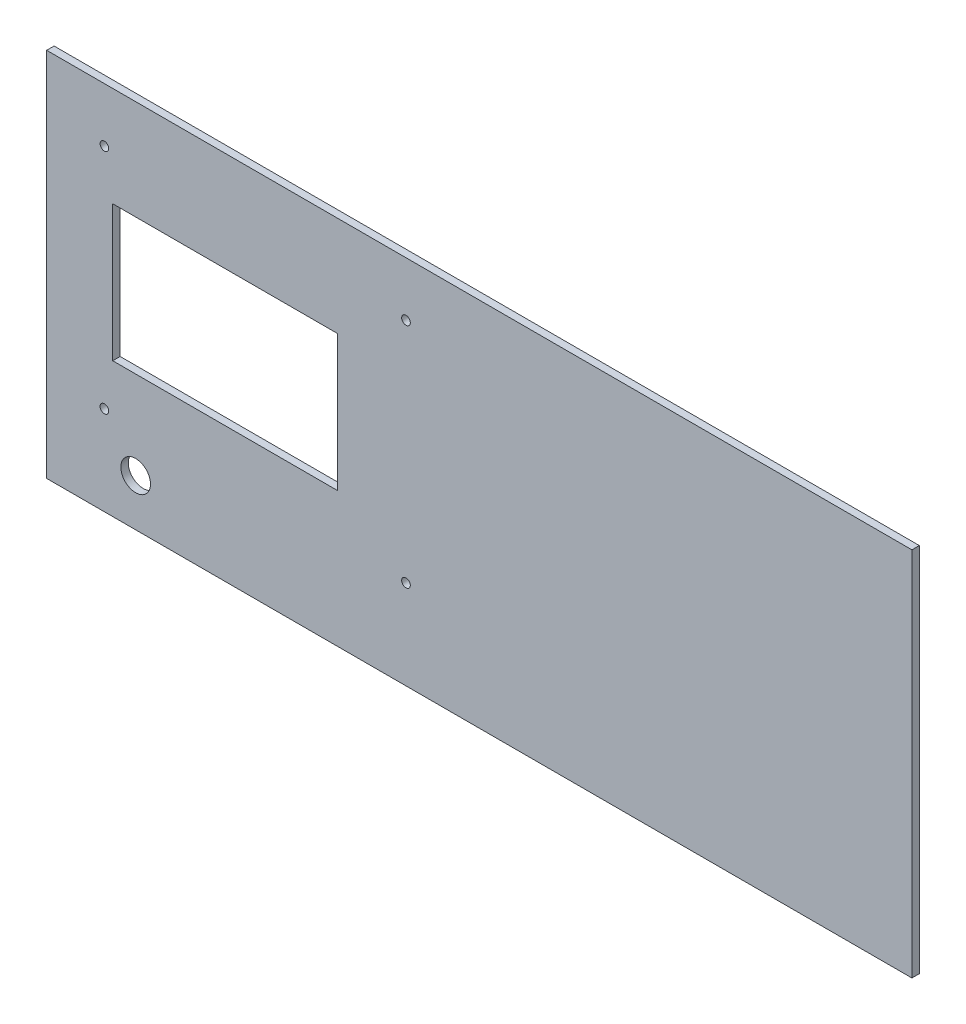
ISO-10303-21;
HEADER;
FILE_DESCRIPTION(('STEP AP214'),'2;1');
FILE_NAME('part.step','',(''),(''),'','','');
FILE_SCHEMA(('AUTOMOTIVE_DESIGN { 1 0 10303 214 1 1 1 1 }'));
ENDSEC;
DATA;
#1=APPLICATION_CONTEXT('core data for automotive mechanical design processes');
#2=APPLICATION_PROTOCOL_DEFINITION('international standard','automotive_design',2000,#1);
#3=PRODUCT_CONTEXT('',#1,'mechanical');
#4=PRODUCT('Part','Part','',(#3));
#5=PRODUCT_RELATED_PRODUCT_CATEGORY('part','',(#4));
#6=PRODUCT_DEFINITION_FORMATION('','',#4);
#7=PRODUCT_DEFINITION_CONTEXT('part definition',#1,'design');
#8=PRODUCT_DEFINITION('design','',#6,#7);
#9=PRODUCT_DEFINITION_SHAPE('','',#8);
#10=(LENGTH_UNIT() NAMED_UNIT(*) SI_UNIT(.MILLI.,.METRE.));
#11=(NAMED_UNIT(*) PLANE_ANGLE_UNIT() SI_UNIT($,.RADIAN.));
#12=(NAMED_UNIT(*) SI_UNIT($,.STERADIAN.) SOLID_ANGLE_UNIT());
#13=UNCERTAINTY_MEASURE_WITH_UNIT(LENGTH_MEASURE(1.E-05),#10,'distance_accuracy_value','');
#14=(GEOMETRIC_REPRESENTATION_CONTEXT(3) GLOBAL_UNCERTAINTY_ASSIGNED_CONTEXT((#13)) GLOBAL_UNIT_ASSIGNED_CONTEXT((#10,
#11,#12)) REPRESENTATION_CONTEXT('',''));
#15=CARTESIAN_POINT('',(0.,0.,0.));
#16=DIRECTION('',(0.,0.,1.));
#17=DIRECTION('',(1.,0.,0.));
#18=AXIS2_PLACEMENT_3D('',#15,#16,#17);
#19=CARTESIAN_POINT('',(0.,0.,3.));
#20=DIRECTION('',(0.,0.,1.));
#21=DIRECTION('',(1.,0.,0.));
#22=AXIS2_PLACEMENT_3D('',#19,#20,#21);
#23=PLANE('',#22);
#24=CARTESIAN_POINT('',(-151.652414133704,36.0955266915026,3.));
#25=DIRECTION('',(0.,0.,1.));
#26=DIRECTION('',(1.,0.,0.));
#27=AXIS2_PLACEMENT_3D('',#24,#25,#26);
#28=CIRCLE('',#27,1.75000000000001);
#29=CARTESIAN_POINT('',(-149.902414133704,36.0955266915026,3.));
#30=VERTEX_POINT('',#29);
#31=EDGE_CURVE('E252',#30,#30,#28,.T.);
#32=ORIENTED_EDGE('',*,*,#31,.F.);
#33=EDGE_LOOP('',(#32));
#34=FACE_BOUND('',#33,.T.);
#35=CARTESIAN_POINT('',(-29.6524141337037,36.0955266915026,3.));
#36=DIRECTION('',(0.,0.,1.));
#37=DIRECTION('',(1.,0.,0.));
#38=AXIS2_PLACEMENT_3D('',#35,#36,#37);
#39=CIRCLE('',#38,1.75);
#40=CARTESIAN_POINT('',(-27.9024141337037,36.0955266915026,3.));
#41=VERTEX_POINT('',#40);
#42=EDGE_CURVE('E264',#41,#41,#39,.T.);
#43=ORIENTED_EDGE('',*,*,#42,.F.);
#44=EDGE_LOOP('',(#43));
#45=FACE_BOUND('',#44,.T.);
#46=DIRECTION('',(1.,0.,0.));
#47=VECTOR('',#46,1.);
#48=CARTESIAN_POINT('',(-57.2774141337037,54.5955266915026,3.));
#49=LINE('',#48,#47);
#50=CARTESIAN_POINT('',(-148.277414133704,54.5955266915026,3.));
#51=VERTEX_POINT('',#50);
#52=CARTESIAN_POINT('',(-57.2774141337037,54.5955266915026,3.));
#53=VERTEX_POINT('',#52);
#54=EDGE_CURVE('E109',#51,#53,#49,.T.);
#55=ORIENTED_EDGE('',*,*,#54,.F.);
#56=DIRECTION('',(0.,-1.,0.));
#57=VECTOR('',#56,1.);
#58=CARTESIAN_POINT('',(-148.277414133704,109.595526691503,3.));
#59=LINE('',#58,#57);
#60=CARTESIAN_POINT('',(-148.277414133704,109.595526691503,3.));
#61=VERTEX_POINT('',#60);
#62=EDGE_CURVE('E101',#61,#51,#59,.T.);
#63=ORIENTED_EDGE('',*,*,#62,.F.);
#64=DIRECTION('',(-1.,0.,0.));
#65=VECTOR('',#64,1.);
#66=CARTESIAN_POINT('',(-57.2774141337037,109.595526691503,3.));
#67=LINE('',#66,#65);
#68=CARTESIAN_POINT('',(-57.2774141337037,109.595526691503,3.));
#69=VERTEX_POINT('',#68);
#70=EDGE_CURVE('E124',#69,#61,#67,.T.);
#71=ORIENTED_EDGE('',*,*,#70,.F.);
#72=DIRECTION('',(0.,1.,0.));
#73=VECTOR('',#72,1.);
#74=CARTESIAN_POINT('',(-57.2774141337037,109.595526691503,3.));
#75=LINE('',#74,#73);
#76=EDGE_CURVE('E122',#53,#69,#75,.T.);
#77=ORIENTED_EDGE('',*,*,#76,.F.);
#78=EDGE_LOOP('',(#55,#63,#71,#77));
#79=FACE_BOUND('',#78,.T.);
#80=DIRECTION('',(-1.,0.,0.));
#81=VECTOR('',#80,1.);
#82=CARTESIAN_POINT('',(175.,150.,3.));
#83=LINE('',#82,#81);
#84=CARTESIAN_POINT('',(175.,150.,3.));
#85=VERTEX_POINT('',#84);
#86=CARTESIAN_POINT('',(-175.,150.,3.));
#87=VERTEX_POINT('',#86);
#88=EDGE_CURVE('E140',#85,#87,#83,.T.);
#89=ORIENTED_EDGE('',*,*,#88,.T.);
#90=DIRECTION('',(0.,-1.,0.));
#91=VECTOR('',#90,1.);
#92=CARTESIAN_POINT('',(-175.,150.,3.));
#93=LINE('',#92,#91);
#94=CARTESIAN_POINT('',(-175.,0.,3.));
#95=VERTEX_POINT('',#94);
#96=EDGE_CURVE('E143',#87,#95,#93,.T.);
#97=ORIENTED_EDGE('',*,*,#96,.T.);
#98=DIRECTION('',(1.,0.,0.));
#99=VECTOR('',#98,1.);
#100=CARTESIAN_POINT('',(-175.,0.,3.));
#101=LINE('',#100,#99);
#102=CARTESIAN_POINT('',(175.,0.,3.));
#103=VERTEX_POINT('',#102);
#104=EDGE_CURVE('E146',#95,#103,#101,.T.);
#105=ORIENTED_EDGE('',*,*,#104,.T.);
#106=DIRECTION('',(0.,1.,0.));
#107=VECTOR('',#106,1.);
#108=CARTESIAN_POINT('',(175.,0.,3.));
#109=LINE('',#108,#107);
#110=EDGE_CURVE('E148',#103,#85,#109,.T.);
#111=ORIENTED_EDGE('',*,*,#110,.T.);
#112=EDGE_LOOP('',(#89,#97,#105,#111));
#113=FACE_BOUND('',#112,.T.);
#114=CARTESIAN_POINT('',(-151.652414133704,128.095526691503,3.));
#115=DIRECTION('',(0.,0.,1.));
#116=DIRECTION('',(1.,0.,0.));
#117=AXIS2_PLACEMENT_3D('',#114,#115,#116);
#118=CIRCLE('',#117,1.75000000000001);
#119=CARTESIAN_POINT('',(-149.902414133704,128.095526691503,3.));
#120=VERTEX_POINT('',#119);
#121=EDGE_CURVE('E130',#120,#120,#118,.T.);
#122=ORIENTED_EDGE('',*,*,#121,.F.);
#123=EDGE_LOOP('',(#122));
#124=FACE_BOUND('',#123,.T.);
#125=CARTESIAN_POINT('',(-29.6524141337037,128.095526691503,3.));
#126=DIRECTION('',(0.,0.,1.));
#127=DIRECTION('',(1.,0.,0.));
#128=AXIS2_PLACEMENT_3D('',#125,#126,#127);
#129=CIRCLE('',#128,1.75);
#130=CARTESIAN_POINT('',(-27.9024141337037,128.095526691503,3.));
#131=VERTEX_POINT('',#130);
#132=EDGE_CURVE('E258',#131,#131,#129,.T.);
#133=ORIENTED_EDGE('',*,*,#132,.F.);
#134=EDGE_LOOP('',(#133));
#135=FACE_BOUND('',#134,.T.);
#136=CARTESIAN_POINT('',(-139.,19.,3.));
#137=DIRECTION('',(0.,0.,1.));
#138=DIRECTION('',(1.,0.,0.));
#139=AXIS2_PLACEMENT_3D('',#136,#137,#138);
#140=CIRCLE('',#139,6.00000000000002);
#141=CARTESIAN_POINT('',(-133.,19.,3.));
#142=VERTEX_POINT('',#141);
#143=EDGE_CURVE('E243',#142,#142,#140,.T.);
#144=ORIENTED_EDGE('',*,*,#143,.F.);
#145=EDGE_LOOP('',(#144));
#146=FACE_BOUND('',#145,.T.);
#147=ADVANCED_FACE('F36',(#34,#45,#79,#113,#124,#135,#146),#23,.T.);
#148=CARTESIAN_POINT('',(0.,0.,0.));
#149=DIRECTION('',(0.,0.,1.));
#150=DIRECTION('',(1.,0.,0.));
#151=AXIS2_PLACEMENT_3D('',#148,#149,#150);
#152=PLANE('',#151);
#153=DIRECTION('',(-1.,0.,0.));
#154=VECTOR('',#153,1.);
#155=CARTESIAN_POINT('',(175.,150.,0.));
#156=LINE('',#155,#154);
#157=CARTESIAN_POINT('',(175.,150.,0.));
#158=VERTEX_POINT('',#157);
#159=CARTESIAN_POINT('',(-175.,150.,0.));
#160=VERTEX_POINT('',#159);
#161=EDGE_CURVE('E117',#158,#160,#156,.T.);
#162=ORIENTED_EDGE('',*,*,#161,.F.);
#163=DIRECTION('',(0.,1.,0.));
#164=VECTOR('',#163,1.);
#165=CARTESIAN_POINT('',(175.,0.,0.));
#166=LINE('',#165,#164);
#167=CARTESIAN_POINT('',(175.,0.,0.));
#168=VERTEX_POINT('',#167);
#169=EDGE_CURVE('E144',#168,#158,#166,.T.);
#170=ORIENTED_EDGE('',*,*,#169,.F.);
#171=DIRECTION('',(1.,0.,0.));
#172=VECTOR('',#171,1.);
#173=CARTESIAN_POINT('',(-175.,0.,0.));
#174=LINE('',#173,#172);
#175=CARTESIAN_POINT('',(-175.,0.,0.));
#176=VERTEX_POINT('',#175);
#177=EDGE_CURVE('E155',#176,#168,#174,.T.);
#178=ORIENTED_EDGE('',*,*,#177,.F.);
#179=DIRECTION('',(0.,-1.,0.));
#180=VECTOR('',#179,1.);
#181=CARTESIAN_POINT('',(-175.,150.,0.));
#182=LINE('',#181,#180);
#183=EDGE_CURVE('E153',#160,#176,#182,.T.);
#184=ORIENTED_EDGE('',*,*,#183,.F.);
#185=EDGE_LOOP('',(#162,#170,#178,#184));
#186=FACE_BOUND('',#185,.T.);
#187=DIRECTION('',(0.,-1.,0.));
#188=VECTOR('',#187,1.);
#189=CARTESIAN_POINT('',(-148.277414133704,109.595526691503,0.));
#190=LINE('',#189,#188);
#191=CARTESIAN_POINT('',(-148.277414133704,109.595526691503,0.));
#192=VERTEX_POINT('',#191);
#193=CARTESIAN_POINT('',(-148.277414133704,54.5955266915026,0.));
#194=VERTEX_POINT('',#193);
#195=EDGE_CURVE('E59',#192,#194,#190,.T.);
#196=ORIENTED_EDGE('',*,*,#195,.T.);
#197=DIRECTION('',(1.,0.,0.));
#198=VECTOR('',#197,1.);
#199=CARTESIAN_POINT('',(-57.2774141337037,54.5955266915026,0.));
#200=LINE('',#199,#198);
#201=CARTESIAN_POINT('',(-57.2774141337037,54.5955266915026,0.));
#202=VERTEX_POINT('',#201);
#203=EDGE_CURVE('E116',#194,#202,#200,.T.);
#204=ORIENTED_EDGE('',*,*,#203,.T.);
#205=DIRECTION('',(0.,1.,0.));
#206=VECTOR('',#205,1.);
#207=CARTESIAN_POINT('',(-57.2774141337037,109.595526691503,0.));
#208=LINE('',#207,#206);
#209=CARTESIAN_POINT('',(-57.2774141337037,109.595526691503,0.));
#210=VERTEX_POINT('',#209);
#211=EDGE_CURVE('E132',#202,#210,#208,.T.);
#212=ORIENTED_EDGE('',*,*,#211,.T.);
#213=DIRECTION('',(-1.,0.,0.));
#214=VECTOR('',#213,1.);
#215=CARTESIAN_POINT('',(-57.2774141337037,109.595526691503,0.));
#216=LINE('',#215,#214);
#217=EDGE_CURVE('E110',#210,#192,#216,.T.);
#218=ORIENTED_EDGE('',*,*,#217,.T.);
#219=EDGE_LOOP('',(#196,#204,#212,#218));
#220=FACE_BOUND('',#219,.T.);
#221=CARTESIAN_POINT('',(-151.652414133704,128.095526691503,0.));
#222=DIRECTION('',(0.,0.,1.));
#223=DIRECTION('',(1.,0.,0.));
#224=AXIS2_PLACEMENT_3D('',#221,#222,#223);
#225=CIRCLE('',#224,1.75000000000001);
#226=CARTESIAN_POINT('',(-149.902414133704,128.095526691503,0.));
#227=VERTEX_POINT('',#226);
#228=EDGE_CURVE('E267',#227,#227,#225,.T.);
#229=ORIENTED_EDGE('',*,*,#228,.T.);
#230=EDGE_LOOP('',(#229));
#231=FACE_BOUND('',#230,.T.);
#232=CARTESIAN_POINT('',(-29.6524141337037,36.0955266915026,0.));
#233=DIRECTION('',(0.,0.,1.));
#234=DIRECTION('',(1.,0.,0.));
#235=AXIS2_PLACEMENT_3D('',#232,#233,#234);
#236=CIRCLE('',#235,1.75);
#237=CARTESIAN_POINT('',(-27.9024141337037,36.0955266915026,0.));
#238=VERTEX_POINT('',#237);
#239=EDGE_CURVE('E261',#238,#238,#236,.T.);
#240=ORIENTED_EDGE('',*,*,#239,.T.);
#241=EDGE_LOOP('',(#240));
#242=FACE_BOUND('',#241,.T.);
#243=CARTESIAN_POINT('',(-29.6524141337037,128.095526691503,0.));
#244=DIRECTION('',(0.,0.,1.));
#245=DIRECTION('',(1.,0.,0.));
#246=AXIS2_PLACEMENT_3D('',#243,#244,#245);
#247=CIRCLE('',#246,1.75);
#248=CARTESIAN_POINT('',(-27.9024141337037,128.095526691503,0.));
#249=VERTEX_POINT('',#248);
#250=EDGE_CURVE('E255',#249,#249,#247,.T.);
#251=ORIENTED_EDGE('',*,*,#250,.T.);
#252=EDGE_LOOP('',(#251));
#253=FACE_BOUND('',#252,.T.);
#254=CARTESIAN_POINT('',(-151.652414133704,36.0955266915026,0.));
#255=DIRECTION('',(0.,0.,1.));
#256=DIRECTION('',(1.,0.,0.));
#257=AXIS2_PLACEMENT_3D('',#254,#255,#256);
#258=CIRCLE('',#257,1.75000000000001);
#259=CARTESIAN_POINT('',(-149.902414133704,36.0955266915026,0.));
#260=VERTEX_POINT('',#259);
#261=EDGE_CURVE('E249',#260,#260,#258,.T.);
#262=ORIENTED_EDGE('',*,*,#261,.T.);
#263=EDGE_LOOP('',(#262));
#264=FACE_BOUND('',#263,.T.);
#265=CARTESIAN_POINT('',(-139.,19.,0.));
#266=DIRECTION('',(0.,0.,1.));
#267=DIRECTION('',(1.,0.,0.));
#268=AXIS2_PLACEMENT_3D('',#265,#266,#267);
#269=CIRCLE('',#268,6.00000000000002);
#270=CARTESIAN_POINT('',(-133.,19.,0.));
#271=VERTEX_POINT('',#270);
#272=EDGE_CURVE('E246',#271,#271,#269,.T.);
#273=ORIENTED_EDGE('',*,*,#272,.T.);
#274=EDGE_LOOP('',(#273));
#275=FACE_BOUND('',#274,.T.);
#276=ADVANCED_FACE('F173',(#186,#220,#231,#242,#253,#264,#275),#152,.F.);
#277=CARTESIAN_POINT('',(175.,150.,3.));
#278=DIRECTION('',(0.,-1.,0.));
#279=DIRECTION('',(0.,0.,-1.));
#280=AXIS2_PLACEMENT_3D('',#277,#278,#279);
#281=PLANE('',#280);
#282=ORIENTED_EDGE('',*,*,#161,.T.);
#283=DIRECTION('',(0.,0.,-1.));
#284=VECTOR('',#283,1.);
#285=CARTESIAN_POINT('',(-175.,150.,3.));
#286=LINE('',#285,#284);
#287=EDGE_CURVE('E11',#87,#160,#286,.T.);
#288=ORIENTED_EDGE('',*,*,#287,.F.);
#289=ORIENTED_EDGE('',*,*,#88,.F.);
#290=DIRECTION('',(0.,0.,-1.));
#291=VECTOR('',#290,1.);
#292=CARTESIAN_POINT('',(175.,150.,3.));
#293=LINE('',#292,#291);
#294=EDGE_CURVE('E150',#85,#158,#293,.T.);
#295=ORIENTED_EDGE('',*,*,#294,.T.);
#296=EDGE_LOOP('',(#282,#288,#289,#295));
#297=FACE_BOUND('',#296,.T.);
#298=ADVANCED_FACE('F38',(#297),#281,.F.);
#299=CARTESIAN_POINT('',(-175.,150.,3.));
#300=DIRECTION('',(1.,0.,0.));
#301=DIRECTION('',(0.,0.,-1.));
#302=AXIS2_PLACEMENT_3D('',#299,#300,#301);
#303=PLANE('',#302);
#304=ORIENTED_EDGE('',*,*,#183,.T.);
#305=DIRECTION('',(0.,0.,-1.));
#306=VECTOR('',#305,1.);
#307=CARTESIAN_POINT('',(-175.,0.,3.));
#308=LINE('',#307,#306);
#309=EDGE_CURVE('E44',#95,#176,#308,.T.);
#310=ORIENTED_EDGE('',*,*,#309,.F.);
#311=ORIENTED_EDGE('',*,*,#96,.F.);
#312=ORIENTED_EDGE('',*,*,#287,.T.);
#313=EDGE_LOOP('',(#304,#310,#311,#312));
#314=FACE_BOUND('',#313,.T.);
#315=ADVANCED_FACE('F183',(#314),#303,.F.);
#316=CARTESIAN_POINT('',(-175.,0.,3.));
#317=DIRECTION('',(0.,1.,0.));
#318=DIRECTION('',(0.,0.,1.));
#319=AXIS2_PLACEMENT_3D('',#316,#317,#318);
#320=PLANE('',#319);
#321=ORIENTED_EDGE('',*,*,#177,.T.);
#322=DIRECTION('',(0.,0.,-1.));
#323=VECTOR('',#322,1.);
#324=CARTESIAN_POINT('',(175.,0.,3.));
#325=LINE('',#324,#323);
#326=EDGE_CURVE('E160',#103,#168,#325,.T.);
#327=ORIENTED_EDGE('',*,*,#326,.F.);
#328=ORIENTED_EDGE('',*,*,#104,.F.);
#329=ORIENTED_EDGE('',*,*,#309,.T.);
#330=EDGE_LOOP('',(#321,#327,#328,#329));
#331=FACE_BOUND('',#330,.T.);
#332=ADVANCED_FACE('F167',(#331),#320,.F.);
#333=CARTESIAN_POINT('',(175.,0.,3.));
#334=DIRECTION('',(-1.,0.,0.));
#335=DIRECTION('',(0.,0.,1.));
#336=AXIS2_PLACEMENT_3D('',#333,#334,#335);
#337=PLANE('',#336);
#338=ORIENTED_EDGE('',*,*,#169,.T.);
#339=ORIENTED_EDGE('',*,*,#294,.F.);
#340=ORIENTED_EDGE('',*,*,#110,.F.);
#341=ORIENTED_EDGE('',*,*,#326,.T.);
#342=EDGE_LOOP('',(#338,#339,#340,#341));
#343=FACE_BOUND('',#342,.T.);
#344=ADVANCED_FACE('F177',(#343),#337,.F.);
#345=CARTESIAN_POINT('',(-148.277414133704,109.595526691503,3.));
#346=DIRECTION('',(1.,0.,0.));
#347=DIRECTION('',(0.,0.,-1.));
#348=AXIS2_PLACEMENT_3D('',#345,#346,#347);
#349=PLANE('',#348);
#350=ORIENTED_EDGE('',*,*,#195,.F.);
#351=DIRECTION('',(0.,0.,-1.));
#352=VECTOR('',#351,1.);
#353=CARTESIAN_POINT('',(-148.277414133704,109.595526691503,3.));
#354=LINE('',#353,#352);
#355=EDGE_CURVE('E105',#61,#192,#354,.T.);
#356=ORIENTED_EDGE('',*,*,#355,.F.);
#357=ORIENTED_EDGE('',*,*,#62,.T.);
#358=DIRECTION('',(0.,0.,-1.));
#359=VECTOR('',#358,1.);
#360=CARTESIAN_POINT('',(-148.277414133704,54.5955266915026,3.));
#361=LINE('',#360,#359);
#362=EDGE_CURVE('E104',#51,#194,#361,.T.);
#363=ORIENTED_EDGE('',*,*,#362,.T.);
#364=EDGE_LOOP('',(#350,#356,#357,#363));
#365=FACE_BOUND('',#364,.T.);
#366=ADVANCED_FACE('F103',(#365),#349,.T.);
#367=CARTESIAN_POINT('',(-57.2774141337037,54.5955266915026,3.));
#368=DIRECTION('',(0.,1.,0.));
#369=DIRECTION('',(0.,0.,1.));
#370=AXIS2_PLACEMENT_3D('',#367,#368,#369);
#371=PLANE('',#370);
#372=ORIENTED_EDGE('',*,*,#203,.F.);
#373=ORIENTED_EDGE('',*,*,#362,.F.);
#374=ORIENTED_EDGE('',*,*,#54,.T.);
#375=DIRECTION('',(0.,0.,-1.));
#376=VECTOR('',#375,1.);
#377=CARTESIAN_POINT('',(-57.2774141337037,54.5955266915026,3.));
#378=LINE('',#377,#376);
#379=EDGE_CURVE('E118',#53,#202,#378,.T.);
#380=ORIENTED_EDGE('',*,*,#379,.T.);
#381=EDGE_LOOP('',(#372,#373,#374,#380));
#382=FACE_BOUND('',#381,.T.);
#383=ADVANCED_FACE('F113',(#382),#371,.T.);
#384=CARTESIAN_POINT('',(-57.2774141337037,109.595526691503,3.));
#385=DIRECTION('',(-1.,0.,0.));
#386=DIRECTION('',(0.,0.,1.));
#387=AXIS2_PLACEMENT_3D('',#384,#385,#386);
#388=PLANE('',#387);
#389=ORIENTED_EDGE('',*,*,#211,.F.);
#390=ORIENTED_EDGE('',*,*,#379,.F.);
#391=ORIENTED_EDGE('',*,*,#76,.T.);
#392=DIRECTION('',(0.,0.,-1.));
#393=VECTOR('',#392,1.);
#394=CARTESIAN_POINT('',(-57.2774141337037,109.595526691503,3.));
#395=LINE('',#394,#393);
#396=EDGE_CURVE('E51',#69,#210,#395,.T.);
#397=ORIENTED_EDGE('',*,*,#396,.T.);
#398=EDGE_LOOP('',(#389,#390,#391,#397));
#399=FACE_BOUND('',#398,.T.);
#400=ADVANCED_FACE('F209',(#399),#388,.T.);
#401=CARTESIAN_POINT('',(-57.2774141337037,109.595526691503,3.));
#402=DIRECTION('',(0.,-1.,0.));
#403=DIRECTION('',(0.,0.,-1.));
#404=AXIS2_PLACEMENT_3D('',#401,#402,#403);
#405=PLANE('',#404);
#406=ORIENTED_EDGE('',*,*,#217,.F.);
#407=ORIENTED_EDGE('',*,*,#396,.F.);
#408=ORIENTED_EDGE('',*,*,#70,.T.);
#409=ORIENTED_EDGE('',*,*,#355,.T.);
#410=EDGE_LOOP('',(#406,#407,#408,#409));
#411=FACE_BOUND('',#410,.T.);
#412=ADVANCED_FACE('F213',(#411),#405,.T.);
#413=CARTESIAN_POINT('',(-151.652414133704,128.095526691503,3.));
#414=DIRECTION('',(0.,0.,-1.));
#415=DIRECTION('',(-1.,0.,0.));
#416=AXIS2_PLACEMENT_3D('',#413,#414,#415);
#417=CYLINDRICAL_SURFACE('',#416,1.75000000000001);
#418=ORIENTED_EDGE('',*,*,#121,.T.);
#419=EDGE_LOOP('',(#418));
#420=FACE_BOUND('',#419,.T.);
#421=ORIENTED_EDGE('',*,*,#228,.F.);
#422=EDGE_LOOP('',(#421));
#423=FACE_BOUND('',#422,.T.);
#424=ADVANCED_FACE('F219',(#420,#423),#417,.F.);
#425=CARTESIAN_POINT('',(-29.6524141337037,36.0955266915026,3.));
#426=DIRECTION('',(0.,0.,-1.));
#427=DIRECTION('',(-1.,0.,0.));
#428=AXIS2_PLACEMENT_3D('',#425,#426,#427);
#429=CYLINDRICAL_SURFACE('',#428,1.75);
#430=ORIENTED_EDGE('',*,*,#42,.T.);
#431=EDGE_LOOP('',(#430));
#432=FACE_BOUND('',#431,.T.);
#433=ORIENTED_EDGE('',*,*,#239,.F.);
#434=EDGE_LOOP('',(#433));
#435=FACE_BOUND('',#434,.T.);
#436=ADVANCED_FACE('F222',(#432,#435),#429,.F.);
#437=CARTESIAN_POINT('',(-29.6524141337037,128.095526691503,3.));
#438=DIRECTION('',(0.,0.,-1.));
#439=DIRECTION('',(-1.,0.,0.));
#440=AXIS2_PLACEMENT_3D('',#437,#438,#439);
#441=CYLINDRICAL_SURFACE('',#440,1.75);
#442=ORIENTED_EDGE('',*,*,#132,.T.);
#443=EDGE_LOOP('',(#442));
#444=FACE_BOUND('',#443,.T.);
#445=ORIENTED_EDGE('',*,*,#250,.F.);
#446=EDGE_LOOP('',(#445));
#447=FACE_BOUND('',#446,.T.);
#448=ADVANCED_FACE('F226',(#444,#447),#441,.F.);
#449=CARTESIAN_POINT('',(-151.652414133704,36.0955266915026,3.));
#450=DIRECTION('',(0.,0.,-1.));
#451=DIRECTION('',(-1.,0.,0.));
#452=AXIS2_PLACEMENT_3D('',#449,#450,#451);
#453=CYLINDRICAL_SURFACE('',#452,1.75000000000001);
#454=ORIENTED_EDGE('',*,*,#31,.T.);
#455=EDGE_LOOP('',(#454));
#456=FACE_BOUND('',#455,.T.);
#457=ORIENTED_EDGE('',*,*,#261,.F.);
#458=EDGE_LOOP('',(#457));
#459=FACE_BOUND('',#458,.T.);
#460=ADVANCED_FACE('F230',(#456,#459),#453,.F.);
#461=CARTESIAN_POINT('',(-139.,19.,3.));
#462=DIRECTION('',(0.,0.,-1.));
#463=DIRECTION('',(-1.,0.,0.));
#464=AXIS2_PLACEMENT_3D('',#461,#462,#463);
#465=CYLINDRICAL_SURFACE('',#464,6.00000000000002);
#466=ORIENTED_EDGE('',*,*,#143,.T.);
#467=EDGE_LOOP('',(#466));
#468=FACE_BOUND('',#467,.T.);
#469=ORIENTED_EDGE('',*,*,#272,.F.);
#470=EDGE_LOOP('',(#469));
#471=FACE_BOUND('',#470,.T.);
#472=ADVANCED_FACE('F234',(#468,#471),#465,.F.);
#473=CLOSED_SHELL('',(#147,#276,#298,#315,#332,#344,#366,#383,#400,#412,#424,#436,#448,#460,#472));
#474=MANIFOLD_SOLID_BREP('B2',#473);
#475=ADVANCED_BREP_SHAPE_REPRESENTATION('',(#18,#474),#14);
#476=SHAPE_DEFINITION_REPRESENTATION(#9,#475);
ENDSEC;
END-ISO-10303-21;
